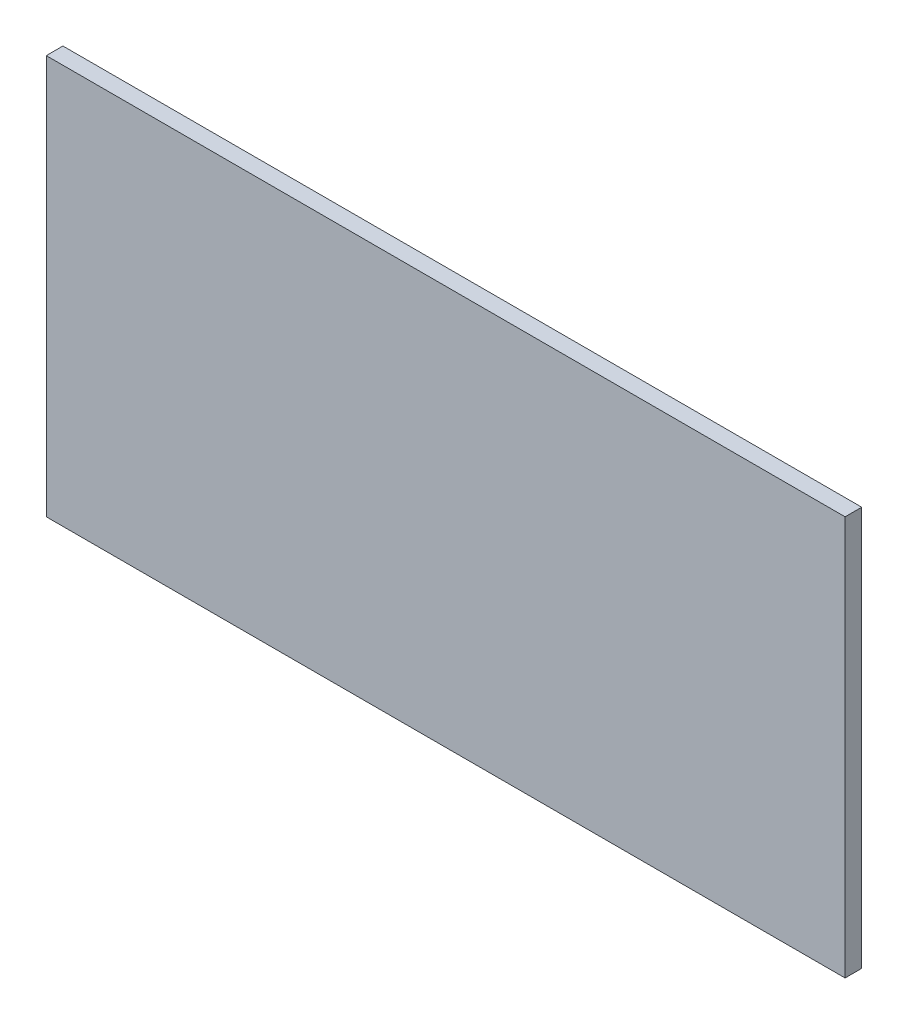
ISO-10303-21;
HEADER;
FILE_DESCRIPTION(('STEP AP214'),'2;1');
FILE_NAME('part.step','',(''),(''),'','','');
FILE_SCHEMA(('AUTOMOTIVE_DESIGN { 1 0 10303 214 1 1 1 1 }'));
ENDSEC;
DATA;
#1=APPLICATION_CONTEXT('core data for automotive mechanical design processes');
#2=APPLICATION_PROTOCOL_DEFINITION('international standard','automotive_design',2000,#1);
#3=PRODUCT_CONTEXT('',#1,'mechanical');
#4=PRODUCT('Part','Part','',(#3));
#5=PRODUCT_RELATED_PRODUCT_CATEGORY('part','',(#4));
#6=PRODUCT_DEFINITION_FORMATION('','',#4);
#7=PRODUCT_DEFINITION_CONTEXT('part definition',#1,'design');
#8=PRODUCT_DEFINITION('design','',#6,#7);
#9=PRODUCT_DEFINITION_SHAPE('','',#8);
#10=(LENGTH_UNIT() NAMED_UNIT(*) SI_UNIT(.MILLI.,.METRE.));
#11=(NAMED_UNIT(*) PLANE_ANGLE_UNIT() SI_UNIT($,.RADIAN.));
#12=(NAMED_UNIT(*) SI_UNIT($,.STERADIAN.) SOLID_ANGLE_UNIT());
#13=UNCERTAINTY_MEASURE_WITH_UNIT(LENGTH_MEASURE(1.E-05),#10,'distance_accuracy_value','');
#14=(GEOMETRIC_REPRESENTATION_CONTEXT(3) GLOBAL_UNCERTAINTY_ASSIGNED_CONTEXT((#13)) GLOBAL_UNIT_ASSIGNED_CONTEXT((#10,
#11,#12)) REPRESENTATION_CONTEXT('',''));
#15=CARTESIAN_POINT('',(0.,0.,0.));
#16=DIRECTION('',(0.,0.,1.));
#17=DIRECTION('',(1.,0.,0.));
#18=AXIS2_PLACEMENT_3D('',#15,#16,#17);
#19=CARTESIAN_POINT('',(600.,-300.,-25.));
#20=DIRECTION('',(1.,0.,0.));
#21=DIRECTION('',(0.,0.,-1.));
#22=AXIS2_PLACEMENT_3D('',#19,#20,#21);
#23=PLANE('',#22);
#24=DIRECTION('',(0.,1.,0.));
#25=VECTOR('',#24,1.);
#26=CARTESIAN_POINT('',(600.,-300.,0.));
#27=LINE('',#26,#25);
#28=CARTESIAN_POINT('',(600.,-300.,0.));
#29=VERTEX_POINT('',#28);
#30=CARTESIAN_POINT('',(600.,300.,0.));
#31=VERTEX_POINT('',#30);
#32=EDGE_CURVE('E103',#29,#31,#27,.T.);
#33=ORIENTED_EDGE('',*,*,#32,.F.);
#34=DIRECTION('',(0.,0.,1.));
#35=VECTOR('',#34,1.);
#36=CARTESIAN_POINT('',(600.,-300.,-25.));
#37=LINE('',#36,#35);
#38=CARTESIAN_POINT('',(600.,-300.,-25.));
#39=VERTEX_POINT('',#38);
#40=EDGE_CURVE('E11',#39,#29,#37,.T.);
#41=ORIENTED_EDGE('',*,*,#40,.F.);
#42=DIRECTION('',(0.,1.,0.));
#43=VECTOR('',#42,1.);
#44=CARTESIAN_POINT('',(600.,-300.,-25.));
#45=LINE('',#44,#43);
#46=CARTESIAN_POINT('',(600.,300.,-25.));
#47=VERTEX_POINT('',#46);
#48=EDGE_CURVE('E100',#39,#47,#45,.T.);
#49=ORIENTED_EDGE('',*,*,#48,.T.);
#50=DIRECTION('',(0.,0.,1.));
#51=VECTOR('',#50,1.);
#52=CARTESIAN_POINT('',(600.,300.,-25.));
#53=LINE('',#52,#51);
#54=EDGE_CURVE('E45',#47,#31,#53,.T.);
#55=ORIENTED_EDGE('',*,*,#54,.T.);
#56=EDGE_LOOP('',(#33,#41,#49,#55));
#57=FACE_BOUND('',#56,.T.);
#58=ADVANCED_FACE('F39',(#57),#23,.T.);
#59=CARTESIAN_POINT('',(-600.,-300.,-25.));
#60=DIRECTION('',(0.,-1.,0.));
#61=DIRECTION('',(0.,0.,-1.));
#62=AXIS2_PLACEMENT_3D('',#59,#60,#61);
#63=PLANE('',#62);
#64=DIRECTION('',(1.,0.,0.));
#65=VECTOR('',#64,1.);
#66=CARTESIAN_POINT('',(-600.,-300.,0.));
#67=LINE('',#66,#65);
#68=CARTESIAN_POINT('',(-600.,-300.,0.));
#69=VERTEX_POINT('',#68);
#70=EDGE_CURVE('E97',#69,#29,#67,.T.);
#71=ORIENTED_EDGE('',*,*,#70,.F.);
#72=DIRECTION('',(0.,0.,1.));
#73=VECTOR('',#72,1.);
#74=CARTESIAN_POINT('',(-600.,-300.,-25.));
#75=LINE('',#74,#73);
#76=CARTESIAN_POINT('',(-600.,-300.,-25.));
#77=VERTEX_POINT('',#76);
#78=EDGE_CURVE('E48',#77,#69,#75,.T.);
#79=ORIENTED_EDGE('',*,*,#78,.F.);
#80=DIRECTION('',(1.,0.,0.));
#81=VECTOR('',#80,1.);
#82=CARTESIAN_POINT('',(-600.,-300.,-25.));
#83=LINE('',#82,#81);
#84=EDGE_CURVE('E94',#77,#39,#83,.T.);
#85=ORIENTED_EDGE('',*,*,#84,.T.);
#86=ORIENTED_EDGE('',*,*,#40,.T.);
#87=EDGE_LOOP('',(#71,#79,#85,#86));
#88=FACE_BOUND('',#87,.T.);
#89=ADVANCED_FACE('F114',(#88),#63,.T.);
#90=CARTESIAN_POINT('',(-600.,-300.,-25.));
#91=DIRECTION('',(-1.,0.,0.));
#92=DIRECTION('',(0.,0.,1.));
#93=AXIS2_PLACEMENT_3D('',#90,#91,#92);
#94=PLANE('',#93);
#95=DIRECTION('',(0.,-1.,0.));
#96=VECTOR('',#95,1.);
#97=CARTESIAN_POINT('',(-600.,-300.,0.));
#98=LINE('',#97,#96);
#99=CARTESIAN_POINT('',(-600.,300.,0.));
#100=VERTEX_POINT('',#99);
#101=EDGE_CURVE('E90',#100,#69,#98,.T.);
#102=ORIENTED_EDGE('',*,*,#101,.F.);
#103=DIRECTION('',(0.,0.,1.));
#104=VECTOR('',#103,1.);
#105=CARTESIAN_POINT('',(-600.,300.,-25.));
#106=LINE('',#105,#104);
#107=CARTESIAN_POINT('',(-600.,300.,-25.));
#108=VERTEX_POINT('',#107);
#109=EDGE_CURVE('E81',#108,#100,#106,.T.);
#110=ORIENTED_EDGE('',*,*,#109,.F.);
#111=DIRECTION('',(0.,-1.,0.));
#112=VECTOR('',#111,1.);
#113=CARTESIAN_POINT('',(-600.,-300.,-25.));
#114=LINE('',#113,#112);
#115=EDGE_CURVE('E87',#108,#77,#114,.T.);
#116=ORIENTED_EDGE('',*,*,#115,.T.);
#117=ORIENTED_EDGE('',*,*,#78,.T.);
#118=EDGE_LOOP('',(#102,#110,#116,#117));
#119=FACE_BOUND('',#118,.T.);
#120=ADVANCED_FACE('F88',(#119),#94,.T.);
#121=CARTESIAN_POINT('',(-600.,300.,-25.));
#122=DIRECTION('',(0.,1.,0.));
#123=DIRECTION('',(0.,0.,1.));
#124=AXIS2_PLACEMENT_3D('',#121,#122,#123);
#125=PLANE('',#124);
#126=DIRECTION('',(-1.,0.,0.));
#127=VECTOR('',#126,1.);
#128=CARTESIAN_POINT('',(-600.,300.,0.));
#129=LINE('',#128,#127);
#130=EDGE_CURVE('E106',#31,#100,#129,.T.);
#131=ORIENTED_EDGE('',*,*,#130,.F.);
#132=ORIENTED_EDGE('',*,*,#54,.F.);
#133=DIRECTION('',(-1.,0.,0.));
#134=VECTOR('',#133,1.);
#135=CARTESIAN_POINT('',(-600.,300.,-25.));
#136=LINE('',#135,#134);
#137=EDGE_CURVE('E91',#47,#108,#136,.T.);
#138=ORIENTED_EDGE('',*,*,#137,.T.);
#139=ORIENTED_EDGE('',*,*,#109,.T.);
#140=EDGE_LOOP('',(#131,#132,#138,#139));
#141=FACE_BOUND('',#140,.T.);
#142=ADVANCED_FACE('F96',(#141),#125,.T.);
#143=CARTESIAN_POINT('',(0.,0.,-25.));
#144=DIRECTION('',(0.,0.,-1.));
#145=DIRECTION('',(-1.,0.,0.));
#146=AXIS2_PLACEMENT_3D('',#143,#144,#145);
#147=PLANE('',#146);
#148=ORIENTED_EDGE('',*,*,#48,.F.);
#149=ORIENTED_EDGE('',*,*,#84,.F.);
#150=ORIENTED_EDGE('',*,*,#115,.F.);
#151=ORIENTED_EDGE('',*,*,#137,.F.);
#152=EDGE_LOOP('',(#148,#149,#150,#151));
#153=FACE_BOUND('',#152,.T.);
#154=ADVANCED_FACE('F95',(#153),#147,.T.);
#155=CARTESIAN_POINT('',(0.,0.,0.));
#156=DIRECTION('',(0.,0.,-1.));
#157=DIRECTION('',(-1.,0.,0.));
#158=AXIS2_PLACEMENT_3D('',#155,#156,#157);
#159=PLANE('',#158);
#160=ORIENTED_EDGE('',*,*,#32,.T.);
#161=ORIENTED_EDGE('',*,*,#130,.T.);
#162=ORIENTED_EDGE('',*,*,#101,.T.);
#163=ORIENTED_EDGE('',*,*,#70,.T.);
#164=EDGE_LOOP('',(#160,#161,#162,#163));
#165=FACE_BOUND('',#164,.T.);
#166=ADVANCED_FACE('F115',(#165),#159,.F.);
#167=CLOSED_SHELL('',(#58,#89,#120,#142,#154,#166));
#168=MANIFOLD_SOLID_BREP('B2',#167);
#169=ADVANCED_BREP_SHAPE_REPRESENTATION('',(#18,#168),#14);
#170=SHAPE_DEFINITION_REPRESENTATION(#9,#169);
ENDSEC;
END-ISO-10303-21;
